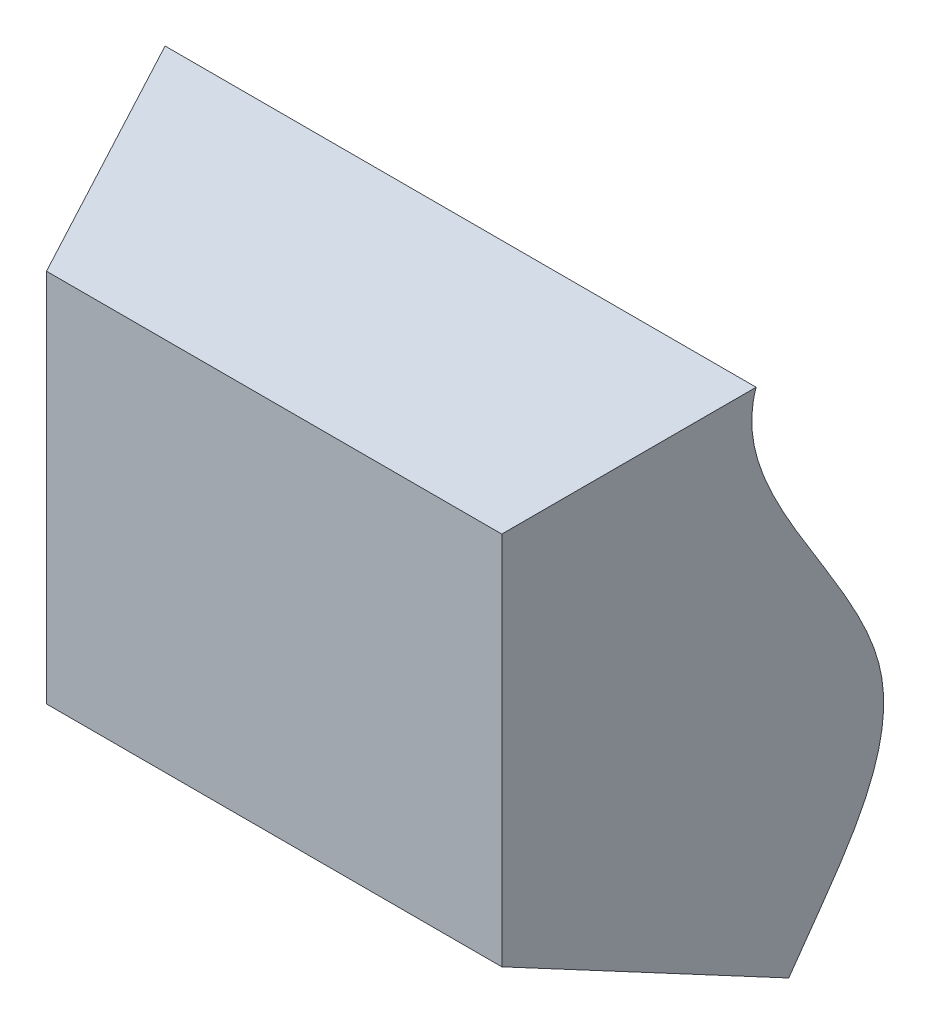
ISO-10303-21;
HEADER;
FILE_DESCRIPTION(('STEP AP214'),'2;1');
FILE_NAME('part.step','',(''),(''),'','','');
FILE_SCHEMA(('AUTOMOTIVE_DESIGN { 1 0 10303 214 1 1 1 1 }'));
ENDSEC;
DATA;
#1=APPLICATION_CONTEXT('core data for automotive mechanical design processes');
#2=APPLICATION_PROTOCOL_DEFINITION('international standard','automotive_design',2000,#1);
#3=PRODUCT_CONTEXT('',#1,'mechanical');
#4=PRODUCT('Part','Part','',(#3));
#5=PRODUCT_RELATED_PRODUCT_CATEGORY('part','',(#4));
#6=PRODUCT_DEFINITION_FORMATION('','',#4);
#7=PRODUCT_DEFINITION_CONTEXT('part definition',#1,'design');
#8=PRODUCT_DEFINITION('design','',#6,#7);
#9=PRODUCT_DEFINITION_SHAPE('','',#8);
#10=(LENGTH_UNIT() NAMED_UNIT(*) SI_UNIT(.MILLI.,.METRE.));
#11=(NAMED_UNIT(*) PLANE_ANGLE_UNIT() SI_UNIT($,.RADIAN.));
#12=(NAMED_UNIT(*) SI_UNIT($,.STERADIAN.) SOLID_ANGLE_UNIT());
#13=UNCERTAINTY_MEASURE_WITH_UNIT(LENGTH_MEASURE(1.E-05),#10,'distance_accuracy_value','');
#14=(GEOMETRIC_REPRESENTATION_CONTEXT(3) GLOBAL_UNCERTAINTY_ASSIGNED_CONTEXT((#13)) GLOBAL_UNIT_ASSIGNED_CONTEXT((#10,
#11,#12)) REPRESENTATION_CONTEXT('',''));
#15=CARTESIAN_POINT('',(0.,0.,0.));
#16=DIRECTION('',(0.,0.,1.));
#17=DIRECTION('',(1.,0.,0.));
#18=AXIS2_PLACEMENT_3D('',#15,#16,#17);
#19=CARTESIAN_POINT('',(-1.52422926449016,4.01313395986018,2.66228518325588));
#20=CARTESIAN_POINT('',(-1.52422926449016,-4.69428085802712,14.918114521293));
#21=CARTESIAN_POINT('',(-1.52422926449016,-20.0739613564952,-7.61610162007118));
#22=CARTESIAN_POINT('',(-1.52422926449016,-37.4957926802031,9.91644933925024));
#23=CARTESIAN_POINT('',(-1.52422926449016,-46.626542049612,9.14556550280767));
#24=B_SPLINE_CURVE_WITH_KNOTS('',3,(#19,#20,#21,#22,#23),.UNSPECIFIED.,.F.,.F.,(4,1,4),(0.,
0.484609084090598,1.),.UNSPECIFIED.);
#25=DIRECTION('',(1.,0.,0.));
#26=VECTOR('',#25,1.);
#27=SURFACE_OF_LINEAR_EXTRUSION('',#24,#26);
#28=CARTESIAN_POINT('',(2.43219013284912,0.229558278628738,6.68238746982329));
#29=CARTESIAN_POINT('',(2.46742385345935,0.0970441090751857,6.77919132160326));
#30=CARTESIAN_POINT('',(2.50166369600981,-0.0377737201951138,6.87326451585633));
#31=CARTESIAN_POINT('',(2.56796246789247,-0.312383616689599,7.05541889454152));
#32=CARTESIAN_POINT('',(2.60001612056221,-0.452186559148769,7.14348558146266));
#33=CARTESIAN_POINT('',(2.66160416851989,-0.736616280233694,7.31269735253467));
#34=CARTESIAN_POINT('',(2.69113676180876,-0.881246408201139,7.39383748573378));
#35=CARTESIAN_POINT('',(2.74743011994639,-1.1755027528195,7.54850221608218));
#36=CARTESIAN_POINT('',(2.77418427615278,-1.32513981024647,7.62200865613578));
#37=CARTESIAN_POINT('',(2.82452903457587,-1.62877825375753,7.76032974309116));
#38=CARTESIAN_POINT('',(2.84812186607649,-1.78277647064532,7.82515051490018));
#39=CARTESIAN_POINT('',(2.89187811127821,-2.09482698722838,7.94536981055188));
#40=CARTESIAN_POINT('',(2.91204292645113,-2.25287759962695,8.00077218490673));
#41=CARTESIAN_POINT('',(2.94576916833134,-2.54690827996364,8.09343427291573));
#42=CARTESIAN_POINT('',(2.9598709851564,-2.68235991471676,8.13217869621604));
#43=CARTESIAN_POINT('',(2.98538718843305,-2.95543557626016,8.20228388854897));
#44=CARTESIAN_POINT('',(2.9968012147991,-3.0930598914939,8.23364366825471));
#45=CARTESIAN_POINT('',(3.01686490980338,-3.37001193867254,8.28876821722974));
#46=CARTESIAN_POINT('',(3.02551475152139,-3.50933956339708,8.31253346203186));
#47=CARTESIAN_POINT('',(3.03999608552973,-3.78872463854823,8.35232060022337));
#48=CARTESIAN_POINT('',(3.04583764517571,-3.92877763489372,8.36837015344508));
#49=CARTESIAN_POINT('',(3.05476569157039,-4.20963901098947,8.3928997593143));
#50=CARTESIAN_POINT('',(3.05785204284153,-4.35044742754237,8.40137943974028));
#51=CARTESIAN_POINT('',(3.06133248045913,-4.63233702758012,8.41094186350445));
#52=CARTESIAN_POINT('',(3.06172648905552,-4.77341821882453,8.41202439322611));
#53=CARTESIAN_POINT('',(3.05912157188877,-5.17933947731718,8.40486744213091));
#54=CARTESIAN_POINT('',(3.052838615123,-5.44404314354702,8.38760516028955));
#55=CARTESIAN_POINT('',(3.0320485643296,-5.97063016747014,8.33048496518535));
#56=CARTESIAN_POINT('',(3.0175384402947,-6.2325124498375,8.290618727046));
#57=CARTESIAN_POINT('',(2.98137247217988,-6.75305013287766,8.1912535462978));
#58=CARTESIAN_POINT('',(2.9596881277654,-7.01168832251325,8.13167629966334));
#59=CARTESIAN_POINT('',(2.91037053265632,-7.52395990960777,7.99617732071933));
#60=CARTESIAN_POINT('',(2.88273785023527,-7.77759378262823,7.92025714972852));
#61=CARTESIAN_POINT('',(2.81473335494654,-8.34570264073964,7.73341633450133));
#62=CARTESIAN_POINT('',(2.77292108958039,-8.65869178622361,7.6185380795516));
#63=CARTESIAN_POINT('',(2.68344214668313,-9.2775902814,7.37269670442471));
#64=CARTESIAN_POINT('',(2.63577100008659,-9.58349401241446,7.24172130559122));
#65=CARTESIAN_POINT('',(2.53615434100682,-10.1894018064236,6.96802678416804));
#66=CARTESIAN_POINT('',(2.48420691095623,-10.4894031471405,6.82530239310533));
#67=CARTESIAN_POINT('',(2.37717582447973,-11.0859516058925,6.53123689983148));
#68=CARTESIAN_POINT('',(2.32208131382086,-11.3824819158893,6.37986597586031));
#69=CARTESIAN_POINT('',(2.21009970245357,-11.9723880025468,6.07219902723455));
#70=CARTESIAN_POINT('',(2.15321364986945,-12.2657654937645,5.91590588227778));
#71=CARTESIAN_POINT('',(2.0386412179706,-12.8511166674371,5.60112071274367));
#72=CARTESIAN_POINT('',(1.98095495243677,-13.143090541679,5.44262900077681));
#73=CARTESIAN_POINT('',(1.88093861286797,-13.6502187676882,5.16783636623503));
#74=CARTESIAN_POINT('',(1.83857319548007,-13.865313335745,5.05143833859602));
#75=CARTESIAN_POINT('',(1.75430934416161,-14.2963072106272,4.81992530982226));
#76=CARTESIAN_POINT('',(1.71241094473469,-14.5122065753598,4.70481040348551));
#77=CARTESIAN_POINT('',(1.62947945712375,-14.9454877724451,4.47695801391266));
#78=CARTESIAN_POINT('',(1.58844655471052,-15.1628699100733,4.36422104107764));
#79=CARTESIAN_POINT('',(1.50766893479681,-15.5998358168156,4.14228635436744));
#80=CARTESIAN_POINT('',(1.46792494150976,-15.8194207359235,4.03309063025231));
#81=CARTESIAN_POINT('',(1.39049771679932,-16.2598016547103,3.82036107870933));
#82=CARTESIAN_POINT('',(1.35280230613282,-16.4805792548726,3.71679378908606));
#83=CARTESIAN_POINT('',(1.27972387309272,-16.9253821334065,3.51601244445926));
#84=CARTESIAN_POINT('',(1.24434067542402,-17.1494071640046,3.4187979078364));
#85=CARTESIAN_POINT('',(1.17652110940266,-17.6011033635659,3.23246518159549));
#86=CARTESIAN_POINT('',(1.14408300956715,-17.8287722963637,3.14334223476743));
#87=CARTESIAN_POINT('',(1.08284327212397,-18.2882501924088,2.97508743896895));
#88=CARTESIAN_POINT('',(1.05404091146709,-18.5200583219828,2.8959536034372));
#89=CARTESIAN_POINT('',(1.00947951237445,-18.9123279007918,2.77352216565086));
#90=CARTESIAN_POINT('',(0.992514610146612,-19.0716189294242,2.72691147985662));
#91=CARTESIAN_POINT('',(0.960890745408349,-19.3921674754266,2.64002562557235));
#92=CARTESIAN_POINT('',(0.946231879589371,-19.5534250749489,2.5997507227399));
#93=CARTESIAN_POINT('',(0.919532407039127,-19.8777337368606,2.52639452479675));
#94=CARTESIAN_POINT('',(0.907490852288261,-20.0407841273236,2.49331062502362));
#95=CARTESIAN_POINT('',(0.88625186853932,-20.3684235641711,2.43495699676124));
#96=CARTESIAN_POINT('',(0.877053772761983,-20.5330122404936,2.40968543631103));
#97=CARTESIAN_POINT('',(0.861445999154776,-20.8630187709568,2.36680343075727));
#98=CARTESIAN_POINT('',(0.855031504438714,-21.0284346876359,2.34917975136768));
#99=CARTESIAN_POINT('',(0.844903349404264,-21.3600485112832,2.32135287410979));
#100=CARTESIAN_POINT('',(0.841190994401872,-21.5262467572059,2.31115326256772));
#101=CARTESIAN_POINT('',(0.836371323107097,-21.85902440128,2.29791132451613));
#102=CARTESIAN_POINT('',(0.83526499628873,-22.0256039201748,2.29487171656413));
#103=CARTESIAN_POINT('',(0.83553981445879,-22.3587381136698,2.29562677328083));
#104=CARTESIAN_POINT('',(0.836920975692536,-22.5252927881007,2.29942148258317));
#105=CARTESIAN_POINT('',(0.842881085325799,-22.9132335264354,2.31579674921803));
#106=CARTESIAN_POINT('',(0.848367938091242,-23.1345024567555,2.33087175329496));
#107=CARTESIAN_POINT('',(0.863155749762865,-23.5759257442207,2.37150093194589));
#108=CARTESIAN_POINT('',(0.872456744928631,-23.7960800907496,2.39705520614229));
#109=CARTESIAN_POINT('',(0.894510343403853,-24.2349592126442,2.45764696997068));
#110=CARTESIAN_POINT('',(0.90726397427458,-24.4536835425341,2.49268728280406));
#111=CARTESIAN_POINT('',(0.935859168069882,-24.8893772070041,2.57125193206158));
#112=CARTESIAN_POINT('',(0.951700622462454,-25.1063466029883,2.61477597029649));
#113=CARTESIAN_POINT('',(0.986380527615629,-25.5416169602043,2.71005822661367));
#114=CARTESIAN_POINT('',(1.00526001212503,-25.7598898045167,2.76192918399421));
#115=CARTESIAN_POINT('',(1.04549646130901,-26.1943971122964,2.87247791956621));
#116=CARTESIAN_POINT('',(1.06685272242711,-26.4106321358505,2.93115376475217));
#117=CARTESIAN_POINT('',(1.11173145835227,-26.8411462311932,3.05445707832022));
#118=CARTESIAN_POINT('',(1.13525377422443,-27.055425445224,3.11908411003225));
#119=CARTESIAN_POINT('',(1.18417409239096,-27.4820884490546,3.25349157954732));
#120=CARTESIAN_POINT('',(1.20957171391019,-27.6944726138758,3.32327097117927));
#121=CARTESIAN_POINT('',(1.2819324948872,-28.2785516116069,3.52208058296771));
#122=CARTESIAN_POINT('',(1.33059472004307,-28.6484472415773,3.65577894776388));
#123=CARTESIAN_POINT('',(1.43166739070761,-29.3838065885179,3.93347382813868));
#124=CARTESIAN_POINT('',(1.48407805753104,-29.7492700423121,4.07747095177461));
#125=CARTESIAN_POINT('',(1.59160302427926,-30.4770304458705,4.37289336994294));
#126=CARTESIAN_POINT('',(1.64671898493223,-30.8393252855758,4.52432322728853));
#127=CARTESIAN_POINT('',(1.75871210830611,-31.5618518617973,4.83202180489246));
#128=CARTESIAN_POINT('',(1.81559040534523,-31.922082084968,4.98829364166449));
#129=CARTESIAN_POINT('',(1.93023631155903,-32.6414958204142,5.3032806802198));
#130=CARTESIAN_POINT('',(1.98800426009295,-33.0006788678285,5.46199681438496));
#131=CARTESIAN_POINT('',(2.10032832110158,-33.6986436849728,5.77060463566763));
#132=CARTESIAN_POINT('',(2.15488122714589,-34.0374299088825,5.92048751318998));
#133=CARTESIAN_POINT('',(2.26335360744191,-34.7157143686012,6.21851292868778));
#134=CARTESIAN_POINT('',(2.31727331700362,-35.0552122808505,6.36665611317214));
#135=CARTESIAN_POINT('',(2.42378913779979,-35.7357113516051,6.6593059256243));
#136=CARTESIAN_POINT('',(2.47638610727068,-36.076711357368,6.80381491157732));
#137=CARTESIAN_POINT('',(2.57955204219067,-36.7610393700416,7.08726098822691));
#138=CARTESIAN_POINT('',(2.63012250709305,-37.1043654274248,7.22620219863751));
#139=CARTESIAN_POINT('',(2.72847234944802,-37.7941970574573,7.49641616971471));
#140=CARTESIAN_POINT('',(2.7762531746492,-38.1407008709294,7.62769290803787));
#141=CARTESIAN_POINT('',(2.82226377550262,-38.4892713834184,7.75410599493817));
#142=B_SPLINE_CURVE_WITH_KNOTS('',3,(#28,#29,#30,#31,#32,#33,#34,#35,#36,#37,#38,#39,#40,#41,
#42,#43,#44,#45,#46,#47,#48,#49,#50,#51,#52,#53,#54,#55,#56,#57,#58,#59,#60,#61,#62,#63,#64,#65,
#66,#67,#68,#69,#70,#71,#72,#73,#74,#75,#76,#77,#78,#79,#80,#81,#82,#83,#84,#85,#86,#87,#88,#89,
#90,#91,#92,#93,#94,#95,#96,#97,#98,#99,#100,#101,#102,#103,#104,#105,#106,#107,#108,#109,#110,
#111,#112,#113,#114,#115,#116,#117,#118,#119,#120,#121,#122,#123,#124,#125,#126,#127,#128,#129,
#130,#131,#132,#133,#134,#135,#136,#137,#138,#139,#140,#141),.UNSPECIFIED.,.F.,.F.,(4,2,2,2,2,2,
2,2,2,2,2,2,2,2,2,2,2,2,2,2,2,2,2,2,2,2,2,2,2,2,2,2,2,2,2,2,2,2,2,2,2,2,2,2,2,2,2,2,2,2,2,2,2,2,
2,2,4),(0.,0.503550833658632,1.00827693077286,1.51336082611055,2.01961982262418,
2.52551991828407,3.03121268740674,3.45575354864464,3.88035125366066,4.30492236722316,
4.72795987938357,5.15101819176081,5.57408872125554,6.36874978473599,7.16370370652077,
7.96185436425453,8.75992880460337,9.76727323271531,10.775390873156,11.7839630614152,
12.7962528069455,13.8079609389182,14.8195266630861,15.5641603791594,16.3088487494769,
17.0536953662273,17.7989534915852,18.5391419866214,19.2792743007138,20.0189686194291,
20.7585156006124,21.2588960019673,21.7592973785405,22.2595172009243,22.7596196347134,
23.2588531807655,23.7583277305781,24.2579918936446,24.7576593199363,25.4228826117133,
26.0881122276589,26.7535400449681,27.4189444777818,28.0942358949828,28.7693359556919,
29.4443865201465,30.1193003925629,31.3079821385124,32.4967341244046,33.6862252190331,
34.8764985131145,36.0672376743712,37.1906048894545,38.3135405105779,39.4357276857063,
40.5570685932276,41.6778222849706),.UNSPECIFIED.);
#143=CARTESIAN_POINT('',(2.9876665244987,-2.9876665244987,8.20854631292063));
#144=VERTEX_POINT('',#143);
#145=CARTESIAN_POINT('',(2.43697260935573,-35.822740495434,6.69552721603427));
#146=VERTEX_POINT('',#145);
#147=EDGE_CURVE('E201',#144,#146,#142,.T.);
#148=ORIENTED_EDGE('',*,*,#147,.F.);
#149=DIRECTION('',(1.,0.,0.));
#150=VECTOR('',#149,1.);
#151=CARTESIAN_POINT('',(-1.52422926449016,-2.9876665244987,8.20854631292063));
#152=LINE('',#151,#150);
#153=CARTESIAN_POINT('',(40.3630567918154,-2.9876665244987,8.20854631292063));
#154=VERTEX_POINT('',#153);
#155=EDGE_CURVE('E123',#154,#144,#152,.F.);
#156=ORIENTED_EDGE('',*,*,#155,.F.);
#157=CARTESIAN_POINT('',(40.5284595408115,-38.4892713834184,7.75410599493818));
#158=CARTESIAN_POINT('',(40.5538965568243,-38.2965202970972,7.6842183678248));
#159=CARTESIAN_POINT('',(40.5798810511172,-38.1043952687143,7.61282655649907));
#160=CARTESIAN_POINT('',(40.6328036084253,-37.7212851201623,7.46742302531515));
#161=CARTESIAN_POINT('',(40.6597416073346,-37.530299924365,7.39341148158666));
#162=CARTESIAN_POINT('',(40.7417587177515,-36.9589887810752,7.16807132270732));
#163=CARTESIAN_POINT('',(40.7980600648293,-36.5801641415258,7.01338464292613));
#164=CARTESIAN_POINT('',(40.9129087765616,-35.8254171220538,6.69784040078817));
#165=CARTESIAN_POINT('',(40.9714563681745,-35.4494950400368,6.53698221486838));
#166=CARTESIAN_POINT('',(41.0898680793054,-34.6993502740604,6.21164871233723));
#167=CARTESIAN_POINT('',(41.1497324458584,-34.3251279251458,6.04717271700285));
#168=CARTESIAN_POINT('',(41.2710409386575,-33.5699487242815,5.71388037224925));
#169=CARTESIAN_POINT('',(41.3324930942456,-33.1890029781305,5.545041962394));
#170=CARTESIAN_POINT('',(41.4548611589159,-32.4264394753976,5.20883846785003));
#171=CARTESIAN_POINT('',(41.5157771460426,-32.0448218266568,5.04147316873582));
#172=CARTESIAN_POINT('',(41.636070989687,-31.2796308625414,4.7109685496233));
#173=CARTESIAN_POINT('',(41.6954492514758,-30.8960580950045,4.54782811615204));
#174=CARTESIAN_POINT('',(41.8115941005229,-30.1255611335395,4.22872276600918));
#175=CARTESIAN_POINT('',(41.8683609562234,-29.7386372889696,4.07275711179878));
#176=CARTESIAN_POINT('',(41.9612874229199,-29.0790915230454,3.81744374288052));
#177=CARTESIAN_POINT('',(41.9984431851064,-28.8076733147782,3.71535912527046));
#178=CARTESIAN_POINT('',(42.0704291517439,-28.2621692391358,3.51757930741623));
#179=CARTESIAN_POINT('',(42.1052591318459,-27.9880831173225,3.42188472356602));
#180=CARTESIAN_POINT('',(42.1720670828779,-27.4368656626656,3.23833138666558));
#181=CARTESIAN_POINT('',(42.2040443846234,-27.1597336323449,3.15047447218466));
#182=CARTESIAN_POINT('',(42.2644428622853,-26.6031129623431,2.98453101863924));
#183=CARTESIAN_POINT('',(42.2928749054598,-26.3236344747449,2.90641462202819));
#184=CARTESIAN_POINT('',(42.3456278452817,-25.7613966978308,2.76147711105755));
#185=CARTESIAN_POINT('',(42.3699493796422,-25.4786379247128,2.69465424459578));
#186=CARTESIAN_POINT('',(42.4137385353698,-24.9099806444857,2.57434452801725));
#187=CARTESIAN_POINT('',(42.4332076043358,-24.6240831003785,2.52085370065524));
#188=CARTESIAN_POINT('',(42.4683840345607,-24.0169411404699,2.42420725291533));
#189=CARTESIAN_POINT('',(42.4834169094939,-23.6953560706039,2.38290476848686));
#190=CARTESIAN_POINT('',(42.5053390832942,-23.0496699713212,2.32267409098509));
#191=CARTESIAN_POINT('',(42.5122276600486,-22.7255687213717,2.30374788190032));
#192=CARTESIAN_POINT('',(42.5156320528147,-22.2397048991191,2.29439438964845));
#193=CARTESIAN_POINT('',(42.5156188243356,-22.0781126765162,2.29443073459604));
#194=CARTESIAN_POINT('',(42.5131880368607,-21.7550673680134,2.301109268295));
#195=CARTESIAN_POINT('',(42.5107704356174,-21.593614284608,2.30775157312009));
#196=CARTESIAN_POINT('',(42.5034311914557,-21.2712704543705,2.32791598073026));
#197=CARTESIAN_POINT('',(42.49851074047,-21.1103794765354,2.34143480870702));
#198=CARTESIAN_POINT('',(42.486093051283,-20.7894534847454,2.37555212935015));
#199=CARTESIAN_POINT('',(42.4785959372188,-20.6294184299314,2.39615028095256));
#200=CARTESIAN_POINT('',(42.4609623123338,-20.3105578673628,2.44459826714735));
#201=CARTESIAN_POINT('',(42.4508252427923,-20.1517326229851,2.47244963681189));
#202=CARTESIAN_POINT('',(42.4279355386491,-19.8357043743285,2.53533858208351));
#203=CARTESIAN_POINT('',(42.4151828305671,-19.6785014157541,2.57037635957567));
#204=CARTESIAN_POINT('',(42.3873478403091,-19.3658049934657,2.64685236678011));
#205=CARTESIAN_POINT('',(42.3722645148162,-19.2103123289346,2.68829346298207));
#206=CARTESIAN_POINT('',(42.340024841947,-18.9011846546983,2.7768712362009));
#207=CARTESIAN_POINT('',(42.322868452097,-18.7475496831251,2.82400802991307));
#208=CARTESIAN_POINT('',(42.2685013094455,-18.2880729498378,2.97338052670832));
#209=CARTESIAN_POINT('',(42.2285183586099,-17.9850246882984,3.08323278129227));
#210=CARTESIAN_POINT('',(42.1429698881945,-17.385928834889,3.31827527202748));
#211=CARTESIAN_POINT('',(42.0974051451526,-17.0898802760429,3.4434633746585));
#212=CARTESIAN_POINT('',(41.9989550481296,-16.483915957489,3.71395279317214));
#213=CARTESIAN_POINT('',(41.9457837242706,-16.1744006755708,3.8600398048373));
#214=CARTESIAN_POINT('',(41.8362069218881,-15.5602780148337,4.16109959507942));
#215=CARTESIAN_POINT('',(41.7798007722885,-15.2556716713038,4.31607421742265));
#216=CARTESIAN_POINT('',(41.6649954221389,-14.6496175083438,4.63149932459122));
#217=CARTESIAN_POINT('',(41.6065957471859,-14.3481704633612,4.79195111282792));
#218=CARTESIAN_POINT('',(41.4888512263254,-13.7463838178825,5.11545152515672));
#219=CARTESIAN_POINT('',(41.4295053173628,-13.446046009959,5.27850306996856));
#220=CARTESIAN_POINT('',(41.3110016759374,-12.8451609736789,5.60408914890793));
#221=CARTESIAN_POINT('',(41.2518438964991,-12.544613824941,5.76662381209977));
#222=CARTESIAN_POINT('',(41.1347626870884,-11.9414936460708,6.088301791198));
#223=CARTESIAN_POINT('',(41.0768391272085,-11.6389208335993,6.24744546402262));
#224=CARTESIAN_POINT('',(40.9737136370424,-11.0854990954349,6.53078041962412));
#225=CARTESIAN_POINT('',(40.9281181749422,-10.8352807961726,6.65605292217406));
#226=CARTESIAN_POINT('',(40.8392145996257,-10.331326835276,6.90031348786488));
#227=CARTESIAN_POINT('',(40.7959068033086,-10.077590692446,7.01930068033238));
#228=CARTESIAN_POINT('',(40.7123693812264,-9.56559197977465,7.24881786118283));
#229=CARTESIAN_POINT('',(40.6721417162158,-9.30732665319386,7.35934246243662));
#230=CARTESIAN_POINT('',(40.5959053763345,-8.78675607908147,7.5688000848024));
#231=CARTESIAN_POINT('',(40.559879736476,-8.52447228281854,7.6677797168352));
#232=CARTESIAN_POINT('',(40.4929711233656,-7.99444099404869,7.85160962052302));
#233=CARTESIAN_POINT('',(40.4620856334457,-7.72669624778866,7.93646680666674));
#234=CARTESIAN_POINT('',(40.4067306210822,-7.18578380618627,8.08855345318915));
#235=CARTESIAN_POINT('',(40.3822546119045,-6.91262189693453,8.1558007357231));
#236=CARTESIAN_POINT('',(40.3453372636793,-6.41838331617304,8.25723031635808));
#237=CARTESIAN_POINT('',(40.3314534055002,-6.19823340600944,8.29537590320007));
#238=CARTESIAN_POINT('',(40.3092705402901,-5.75549983104945,8.35632282446364));
#239=CARTESIAN_POINT('',(40.3009712796841,-5.53291627722185,8.37912485557676));
#240=CARTESIAN_POINT('',(40.2906073112497,-5.08696694927245,8.40759962482604));
#241=CARTESIAN_POINT('',(40.2885288054038,-4.86360400814988,8.41331027270392));
#242=CARTESIAN_POINT('',(40.2910539449215,-4.41717977955227,8.40637250889825));
#243=CARTESIAN_POINT('',(40.2956572297177,-4.19411847645017,8.39372508786531));
#244=CARTESIAN_POINT('',(40.311845720569,-3.74892049833617,8.34924757479621));
#245=CARTESIAN_POINT('',(40.3234689505424,-3.52679554093924,8.31731301290335));
#246=CARTESIAN_POINT('',(40.3537012066968,-3.08664095129082,8.23425057177988));
#247=CARTESIAN_POINT('',(40.3723106300036,-2.86861155258874,8.1831216014552));
#248=CARTESIAN_POINT('',(40.41628404223,-2.43761572937023,8.0623056443069));
#249=CARTESIAN_POINT('',(40.4416721565206,-2.22467040744084,7.99255237357104));
#250=CARTESIAN_POINT('',(40.4986232611513,-1.80605157052178,7.83608049958501));
#251=CARTESIAN_POINT('',(40.5301856513152,-1.60037735103032,7.74936354530571));
#252=CARTESIAN_POINT('',(40.6137767822529,-1.10929520426636,7.51969880058767));
#253=CARTESIAN_POINT('',(40.6687361105153,-0.828120140681054,7.36869928719849));
#254=CARTESIAN_POINT('',(40.7578960482171,-0.420594767613895,7.12373437164286));
#255=CARTESIAN_POINT('',(40.7886213787998,-0.287550856668933,7.03931721966166));
#256=CARTESIAN_POINT('',(40.8521049028424,-0.0258011082619624,6.86489767084716));
#257=CARTESIAN_POINT('',(40.8848617510967,0.102907514560229,6.77489896993594));
#258=CARTESIAN_POINT('',(40.918533183465,0.229558278628738,6.68238746982329));
#259=B_SPLINE_CURVE_WITH_KNOTS('',3,(#157,#158,#159,#160,#161,#162,#163,#164,#165,#166,#167,
#168,#169,#170,#171,#172,#173,#174,#175,#176,#177,#178,#179,#180,#181,#182,#183,#184,#185,#186,
#187,#188,#189,#190,#191,#192,#193,#194,#195,#196,#197,#198,#199,#200,#201,#202,#203,#204,#205,
#206,#207,#208,#209,#210,#211,#212,#213,#214,#215,#216,#217,#218,#219,#220,#221,#222,#223,#224,
#225,#226,#227,#228,#229,#230,#231,#232,#233,#234,#235,#236,#237,#238,#239,#240,#241,#242,#243,
#244,#245,#246,#247,#248,#249,#250,#251,#252,#253,#254,#255,#256,#257,#258),.UNSPECIFIED.,.F.,
.F.,(4,2,2,2,2,2,2,2,2,2,2,2,2,2,2,2,2,2,2,2,2,2,2,2,2,2,2,2,2,2,2,2,2,2,2,2,2,2,2,2,2,2,2,2,2,
2,2,2,2,2,4),(0.,0.61978640859567,1.23953122660126,2.47856001275482,3.7177143205901,
4.95710311825841,6.22068056787118,7.48407094446231,8.74712489133166,10.0100487098077,
10.8870329657246,11.7641016952531,12.641375630491,13.5158906618982,14.3902698943979,
15.2643879669695,16.2373684131699,17.2104351220433,17.6950846853882,18.1797427646896,
18.6641702509459,19.1485744019781,19.6330811558099,20.1176015225741,20.6023394199859,
21.0870872505495,22.0608144789069,23.0344063960307,24.073252293188,25.1123144877197,
26.1516256976305,27.1922008137532,28.2324916767246,29.2726724976765,30.1231502579803,
30.9737455235232,31.8248778365703,32.6724452952966,33.5195965479735,34.3658870959375,
35.0369443112653,35.7079710544237,36.3775083117475,37.0470094403897,37.7201698950745,
38.3933686209371,39.0689959579492,39.7445576525731,40.7139772595905,41.1954502374821,
41.6766077347983),.UNSPECIFIED.);
#260=CARTESIAN_POINT('',(40.9137507069558,-35.8227404954507,6.69552721604139));
#261=VERTEX_POINT('',#260);
#262=EDGE_CURVE('E225',#261,#154,#259,.T.);
#263=ORIENTED_EDGE('',*,*,#262,.F.);
#264=DIRECTION('',(1.,0.,0.));
#265=VECTOR('',#264,1.);
#266=CARTESIAN_POINT('',(-1.52422926449016,-35.822740495434,6.69552721603427));
#267=LINE('',#266,#265);
#268=EDGE_CURVE('E238',#146,#261,#267,.T.);
#269=ORIENTED_EDGE('',*,*,#268,.F.);
#270=EDGE_LOOP('',(#148,#156,#263,#269));
#271=FACE_BOUND('',#270,.T.);
#272=ADVANCED_FACE('F186',(#271),#27,.F.);
#273=CARTESIAN_POINT('',(0.,0.,0.));
#274=DIRECTION('',(-0.939692620785908,0.,0.342020143325669));
#275=DIRECTION('',(0.342020143325669,0.,0.939692620785908));
#276=AXIS2_PLACEMENT_3D('',#273,#274,#275);
#277=PLANE('',#276);
#278=DIRECTION('',(-0.323615577118185,0.323615577118185,-0.889126490715988));
#279=VECTOR('',#278,1.);
#280=CARTESIAN_POINT('',(0.,0.,0.));
#281=LINE('',#280,#279);
#282=CARTESIAN_POINT('',(7.27940468532406,-7.27940468532406,20.));
#283=VERTEX_POINT('',#282);
#284=EDGE_CURVE('E241',#283,#144,#281,.T.);
#285=ORIENTED_EDGE('',*,*,#284,.T.);
#286=ORIENTED_EDGE('',*,*,#147,.T.);
#287=DIRECTION('',(-0.323615577118185,-0.323615577118185,-0.889126490715988));
#288=VECTOR('',#287,1.);
#289=CARTESIAN_POINT('',(0.,-38.2597131047897,0.));
#290=LINE('',#289,#288);
#291=CARTESIAN_POINT('',(7.27940468532406,-30.9803084194656,20.));
#292=VERTEX_POINT('',#291);
#293=EDGE_CURVE('E194',#292,#146,#290,.T.);
#294=ORIENTED_EDGE('',*,*,#293,.F.);
#295=DIRECTION('',(0.,1.,0.));
#296=VECTOR('',#295,1.);
#297=CARTESIAN_POINT('',(7.27940468532406,0.,20.));
#298=LINE('',#297,#296);
#299=EDGE_CURVE('E247',#283,#292,#298,.F.);
#300=ORIENTED_EDGE('',*,*,#299,.F.);
#301=EDGE_LOOP('',(#285,#286,#294,#300));
#302=FACE_BOUND('',#301,.T.);
#303=ADVANCED_FACE('F268',(#302),#277,.T.);
#304=CARTESIAN_POINT('',(0.,-38.2597131047897,0.));
#305=DIRECTION('',(0.,-0.939692620785908,0.342020143325669));
#306=DIRECTION('',(0.,-0.342020143325669,-0.939692620785908));
#307=AXIS2_PLACEMENT_3D('',#304,#305,#306);
#308=PLANE('',#307);
#309=ORIENTED_EDGE('',*,*,#293,.T.);
#310=ORIENTED_EDGE('',*,*,#268,.T.);
#311=DIRECTION('',(0.323615577118185,-0.323615577118185,-0.889126490715988));
#312=VECTOR('',#311,1.);
#313=CARTESIAN_POINT('',(39.3438967445105,-34.2528865329861,11.0086655297012));
#314=LINE('',#313,#312);
#315=CARTESIAN_POINT('',(36.0713186309901,-30.9803084194656,20.));
#316=VERTEX_POINT('',#315);
#317=EDGE_CURVE('E237',#316,#261,#314,.T.);
#318=ORIENTED_EDGE('',*,*,#317,.F.);
#319=DIRECTION('',(-1.,0.,0.));
#320=VECTOR('',#319,1.);
#321=CARTESIAN_POINT('',(0.,-30.9803084194656,20.));
#322=LINE('',#321,#320);
#323=EDGE_CURVE('E249',#292,#316,#322,.F.);
#324=ORIENTED_EDGE('',*,*,#323,.F.);
#325=EDGE_LOOP('',(#309,#310,#318,#324));
#326=FACE_BOUND('',#325,.T.);
#327=ADVANCED_FACE('F188',(#326),#308,.T.);
#328=CARTESIAN_POINT('',(43.3507233163141,0.,0.));
#329=DIRECTION('',(0.939692620785908,0.,0.342020143325669));
#330=DIRECTION('',(0.342020143325669,0.,-0.939692620785908));
#331=AXIS2_PLACEMENT_3D('',#328,#329,#330);
#332=PLANE('',#331);
#333=ORIENTED_EDGE('',*,*,#317,.T.);
#334=ORIENTED_EDGE('',*,*,#262,.T.);
#335=DIRECTION('',(0.323615577118185,0.323615577118185,-0.889126490715988));
#336=VECTOR('',#335,1.);
#337=CARTESIAN_POINT('',(38.8107303055205,-4.53999301079362,12.4735282816372));
#338=LINE('',#337,#336);
#339=CARTESIAN_POINT('',(36.0713186309901,-7.27940468532406,20.));
#340=VERTEX_POINT('',#339);
#341=EDGE_CURVE('E235',#340,#154,#338,.T.);
#342=ORIENTED_EDGE('',*,*,#341,.F.);
#343=DIRECTION('',(0.,-1.,0.));
#344=VECTOR('',#343,1.);
#345=CARTESIAN_POINT('',(36.0713186309901,0.,20.));
#346=LINE('',#345,#344);
#347=EDGE_CURVE('E251',#316,#340,#346,.F.);
#348=ORIENTED_EDGE('',*,*,#347,.F.);
#349=EDGE_LOOP('',(#333,#334,#342,#348));
#350=FACE_BOUND('',#349,.T.);
#351=ADVANCED_FACE('F233',(#350),#332,.T.);
#352=CARTESIAN_POINT('',(0.,0.,0.));
#353=DIRECTION('',(0.,0.939692620785908,0.342020143325669));
#354=DIRECTION('',(0.,-0.342020143325669,0.939692620785908));
#355=AXIS2_PLACEMENT_3D('',#352,#353,#354);
#356=PLANE('',#355);
#357=ORIENTED_EDGE('',*,*,#341,.T.);
#358=ORIENTED_EDGE('',*,*,#155,.T.);
#359=ORIENTED_EDGE('',*,*,#284,.F.);
#360=DIRECTION('',(1.,0.,0.));
#361=VECTOR('',#360,1.);
#362=CARTESIAN_POINT('',(0.,-7.27940468532406,20.));
#363=LINE('',#362,#361);
#364=EDGE_CURVE('E208',#340,#283,#363,.F.);
#365=ORIENTED_EDGE('',*,*,#364,.F.);
#366=EDGE_LOOP('',(#357,#358,#359,#365));
#367=FACE_BOUND('',#366,.T.);
#368=ADVANCED_FACE('F240',(#367),#356,.T.);
#369=CARTESIAN_POINT('',(0.,0.,20.));
#370=DIRECTION('',(0.,0.,1.));
#371=DIRECTION('',(1.,0.,0.));
#372=AXIS2_PLACEMENT_3D('',#369,#370,#371);
#373=PLANE('',#372);
#374=ORIENTED_EDGE('',*,*,#299,.T.);
#375=ORIENTED_EDGE('',*,*,#323,.T.);
#376=ORIENTED_EDGE('',*,*,#347,.T.);
#377=ORIENTED_EDGE('',*,*,#364,.T.);
#378=EDGE_LOOP('',(#374,#375,#376,#377));
#379=FACE_BOUND('',#378,.T.);
#380=ADVANCED_FACE('F252',(#379),#373,.T.);
#381=CLOSED_SHELL('',(#272,#303,#327,#351,#368,#380));
#382=MANIFOLD_SOLID_BREP('B46',#381);
#383=ADVANCED_BREP_SHAPE_REPRESENTATION('',(#18,#382),#14);
#384=SHAPE_DEFINITION_REPRESENTATION(#9,#383);
ENDSEC;
END-ISO-10303-21;
